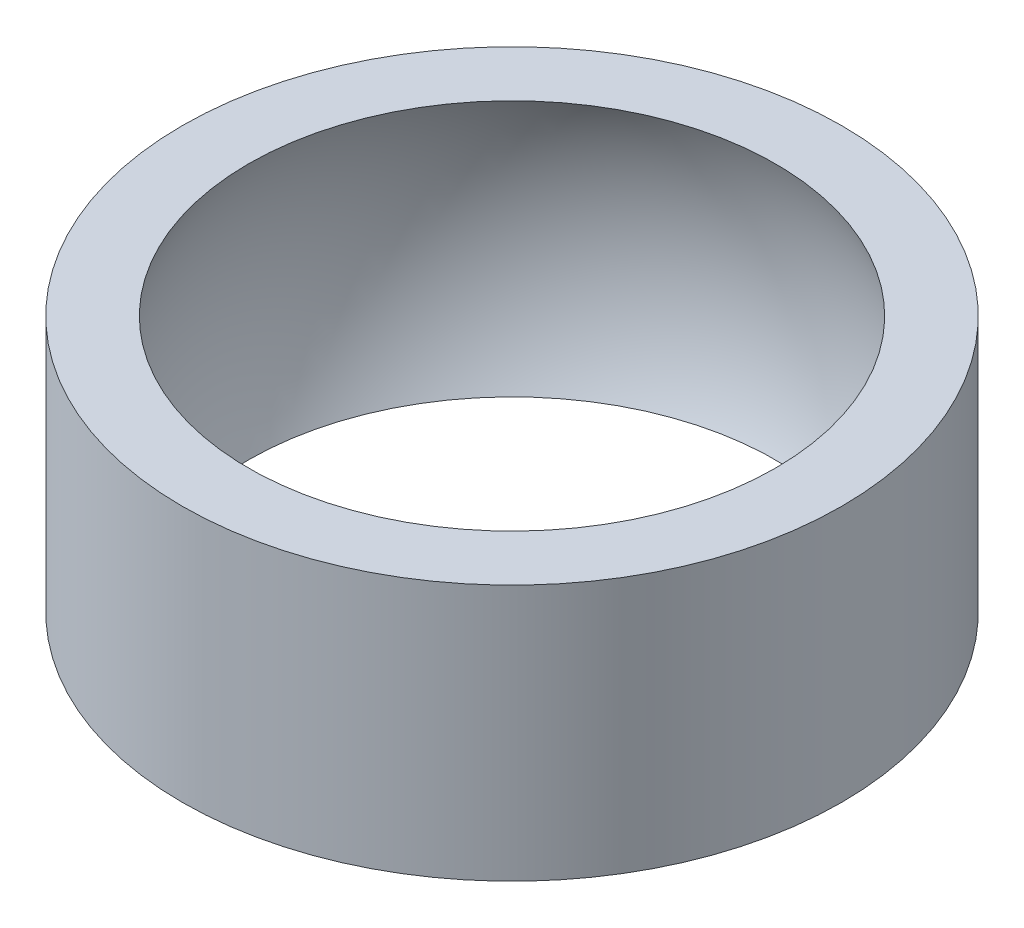
ISO-10303-21;
HEADER;
FILE_DESCRIPTION(('STEP AP214'),'2;1');
FILE_NAME('part.step','',(''),(''),'','','');
FILE_SCHEMA(('AUTOMOTIVE_DESIGN { 1 0 10303 214 1 1 1 1 }'));
ENDSEC;
DATA;
#1=APPLICATION_CONTEXT('core data for automotive mechanical design processes');
#2=APPLICATION_PROTOCOL_DEFINITION('international standard','automotive_design',2000,#1);
#3=PRODUCT_CONTEXT('',#1,'mechanical');
#4=PRODUCT('Part','Part','',(#3));
#5=PRODUCT_RELATED_PRODUCT_CATEGORY('part','',(#4));
#6=PRODUCT_DEFINITION_FORMATION('','',#4);
#7=PRODUCT_DEFINITION_CONTEXT('part definition',#1,'design');
#8=PRODUCT_DEFINITION('design','',#6,#7);
#9=PRODUCT_DEFINITION_SHAPE('','',#8);
#10=(LENGTH_UNIT() NAMED_UNIT(*) SI_UNIT(.MILLI.,.METRE.));
#11=(NAMED_UNIT(*) PLANE_ANGLE_UNIT() SI_UNIT($,.RADIAN.));
#12=(NAMED_UNIT(*) SI_UNIT($,.STERADIAN.) SOLID_ANGLE_UNIT());
#13=UNCERTAINTY_MEASURE_WITH_UNIT(LENGTH_MEASURE(1.E-05),#10,'distance_accuracy_value','');
#14=(GEOMETRIC_REPRESENTATION_CONTEXT(3) GLOBAL_UNCERTAINTY_ASSIGNED_CONTEXT((#13)) GLOBAL_UNIT_ASSIGNED_CONTEXT((#10,
#11,#12)) REPRESENTATION_CONTEXT('',''));
#15=CARTESIAN_POINT('',(0.,0.,0.));
#16=DIRECTION('',(0.,0.,1.));
#17=DIRECTION('',(1.,0.,0.));
#18=AXIS2_PLACEMENT_3D('',#15,#16,#17);
#19=CARTESIAN_POINT('',(0.,0.,0.));
#20=DIRECTION('',(0.,1.,0.));
#21=DIRECTION('',(-1.,0.,0.));
#22=AXIS2_PLACEMENT_3D('',#19,#20,#21);
#23=SPHERICAL_SURFACE('',#22,4.);
#24=CARTESIAN_POINT('',(0.,1.75,0.));
#25=DIRECTION('',(0.,1.,0.));
#26=DIRECTION('',(0.,0.,1.));
#27=AXIS2_PLACEMENT_3D('',#24,#25,#26);
#28=CIRCLE('',#27,3.59687364248454);
#29=CARTESIAN_POINT('',(-3.59687364248454,1.75,0.));
#30=VERTEX_POINT('',#29);
#31=EDGE_CURVE('E10',#30,#30,#28,.T.);
#32=CARTESIAN_POINT('',(0.,-1.75,0.));
#33=DIRECTION('',(0.,1.,0.));
#34=DIRECTION('',(0.,0.,1.));
#35=AXIS2_PLACEMENT_3D('',#32,#33,#34);
#36=CIRCLE('',#35,3.59687364248454);
#37=CARTESIAN_POINT('',(-3.59687364248454,-1.75,0.));
#38=VERTEX_POINT('',#37);
#39=EDGE_CURVE('E46',#38,#38,#36,.T.);
#40=CARTESIAN_POINT('',(-3.59687364248454,1.75,0.));
#41=CARTESIAN_POINT('',(-3.61338272072993,1.71606831182772,0.));
#42=CARTESIAN_POINT('',(-3.62941137263768,1.6819028884554,0.));
#43=CARTESIAN_POINT('',(-3.66049560114603,1.61313221205259,0.));
#44=CARTESIAN_POINT('',(-3.67555117774664,1.57852695902209,0.));
#45=CARTESIAN_POINT('',(-3.70467703300888,1.50890426404481,0.));
#46=CARTESIAN_POINT('',(-3.71874731167052,1.47388682209803,0.));
#47=CARTESIAN_POINT('',(-3.74589134636465,1.40346781453731,0.));
#48=CARTESIAN_POINT('',(-3.75896510239714,1.36806624892338,0.));
#49=CARTESIAN_POINT('',(-3.78410560929955,1.29690734162938,0.));
#50=CARTESIAN_POINT('',(-3.79617236016946,1.26114999994931,0.));
#51=CARTESIAN_POINT('',(-3.81928919571164,1.18930817984011,0.));
#52=CARTESIAN_POINT('',(-3.8303392803839,1.15322370141097,0.));
#53=CARTESIAN_POINT('',(-3.85141393272153,1.08075650730715,0.));
#54=CARTESIAN_POINT('',(-3.8614385003869,1.04437379163247,0.));
#55=CARTESIAN_POINT('',(-3.88045409030962,0.971339261884403,0.));
#56=CARTESIAN_POINT('',(-3.88944511256698,0.934687447811025,0.));
#57=CARTESIAN_POINT('',(-3.90638641074574,0.861144075501694,0.));
#58=CARTESIAN_POINT('',(-3.91433668666715,0.824252517265742,0.));
#59=CARTESIAN_POINT('',(-3.92919012485215,0.750259202912272,0.));
#60=CARTESIAN_POINT('',(-3.93609328711574,0.713157446794754,0.));
#61=CARTESIAN_POINT('',(-3.9488469692709,0.638773451296288,0.));
#62=CARTESIAN_POINT('',(-3.95469748916247,0.601491211915339,0.));
#63=CARTESIAN_POINT('',(-3.96534120092117,0.52677610905884,0.));
#64=CARTESIAN_POINT('',(-3.97013439278831,0.489343245583289,0.));
#65=CARTESIAN_POINT('',(-3.97865960965325,0.414356874339865,0.));
#66=CARTESIAN_POINT('',(-3.98239163465106,0.376803366571991,0.));
#67=CARTESIAN_POINT('',(-3.98879152881636,0.30160578316982,0.));
#68=CARTESIAN_POINT('',(-3.99145939798385,0.263961707535522,0.));
#69=CARTESIAN_POINT('',(-3.99572884380476,0.188613137361727,0.));
#70=CARTESIAN_POINT('',(-3.99733042045817,0.150908642822231,0.));
#71=CARTESIAN_POINT('',(-3.99946599855579,0.0754694321884892,0.));
#72=CARTESIAN_POINT('',(-4.,0.0377347160942446,0.));
#73=CARTESIAN_POINT('',(-4.,-0.0377347160942446,0.));
#74=CARTESIAN_POINT('',(-3.99946599855579,-0.0754694321884892,0.));
#75=CARTESIAN_POINT('',(-3.99733042045817,-0.150908642822231,0.));
#76=CARTESIAN_POINT('',(-3.99572884380476,-0.188613137361727,0.));
#77=CARTESIAN_POINT('',(-3.99145939798385,-0.263961707535522,0.));
#78=CARTESIAN_POINT('',(-3.98879152881636,-0.30160578316982,0.));
#79=CARTESIAN_POINT('',(-3.98239163465106,-0.376803366571991,0.));
#80=CARTESIAN_POINT('',(-3.97865960965325,-0.414356874339865,0.));
#81=CARTESIAN_POINT('',(-3.97013439278831,-0.489343245583289,0.));
#82=CARTESIAN_POINT('',(-3.96534120092117,-0.52677610905884,0.));
#83=CARTESIAN_POINT('',(-3.95469748916247,-0.601491211915339,0.));
#84=CARTESIAN_POINT('',(-3.9488469692709,-0.638773451296288,0.));
#85=CARTESIAN_POINT('',(-3.93609328711574,-0.713157446794755,0.));
#86=CARTESIAN_POINT('',(-3.92919012485215,-0.750259202912272,0.));
#87=CARTESIAN_POINT('',(-3.91433668666715,-0.824252517265742,0.));
#88=CARTESIAN_POINT('',(-3.90638641074574,-0.861144075501694,0.));
#89=CARTESIAN_POINT('',(-3.88944511256698,-0.934687447811025,0.));
#90=CARTESIAN_POINT('',(-3.88045409030962,-0.971339261884402,0.));
#91=CARTESIAN_POINT('',(-3.8614385003869,-1.04437379163247,0.));
#92=CARTESIAN_POINT('',(-3.85141393272153,-1.08075650730715,0.));
#93=CARTESIAN_POINT('',(-3.83033928038391,-1.15322370141097,0.));
#94=CARTESIAN_POINT('',(-3.81928919571164,-1.18930817984011,0.));
#95=CARTESIAN_POINT('',(-3.79617236016946,-1.26114999994931,0.));
#96=CARTESIAN_POINT('',(-3.78410560929955,-1.29690734162938,0.));
#97=CARTESIAN_POINT('',(-3.75896510239714,-1.36806624892338,0.));
#98=CARTESIAN_POINT('',(-3.74589134636465,-1.40346781453731,0.));
#99=CARTESIAN_POINT('',(-3.71874731167052,-1.47388682209803,0.));
#100=CARTESIAN_POINT('',(-3.70467703300888,-1.50890426404481,0.));
#101=CARTESIAN_POINT('',(-3.67555117774664,-1.57852695902209,0.));
#102=CARTESIAN_POINT('',(-3.66049560114603,-1.61313221205259,0.));
#103=CARTESIAN_POINT('',(-3.62941137263768,-1.6819028884554,0.));
#104=CARTESIAN_POINT('',(-3.61338272072993,-1.71606831182772,0.));
#105=CARTESIAN_POINT('',(-3.59687364248454,-1.75,0.));
#106=B_SPLINE_CURVE_WITH_KNOTS('',3,(#40,#41,#42,#43,#44,#45,#46,#47,#48,#49,#50,#51,#52,#53,
#54,#55,#56,#57,#58,#59,#60,#61,#62,#63,#64,#65,#66,#67,#68,#69,#70,#71,#72,#73,#74,#75,#76,#77,
#78,#79,#80,#81,#82,#83,#84,#85,#86,#87,#88,#89,#90,#91,#92,#93,#94,#95,#96,#97,#98,#99,#100,
#101,#102,#103,#104,#105),.UNSPECIFIED.,.F.,.F.,(4,2,2,2,2,2,2,2,2,2,2,2,2,2,2,2,2,2,2,2,2,2,2,
2,2,2,2,2,2,2,2,2,4),(0.,0.113200370777543,0.226400741555087,0.33960111233263,0.452801483110174,
0.566001853887717,0.67920222466526,0.792402595442804,0.905602966220347,1.01880333699789,
1.13200370777543,1.24520407855298,1.35840444933052,1.47160482010806,1.58480519088561,
1.69800556166315,1.81120593244069,1.92440630321824,2.03760667399578,2.15080704477332,
2.26400741555087,2.37720778632841,2.49040815710596,2.6036085278835,2.71680889866104,
2.83000926943859,2.94320964021613,3.05641001099367,3.16961038177122,3.28281075254876,
3.3960111233263,3.50921149410385,3.62241186488139),.UNSPECIFIED.);
#107=EDGE_CURVE('BSEAM32',#30,#38,#106,.T.);
#108=ORIENTED_EDGE('',*,*,#31,.T.);
#109=ORIENTED_EDGE('',*,*,#39,.F.);
#110=ORIENTED_EDGE('',*,*,#107,.T.);
#111=ORIENTED_EDGE('',*,*,#107,.F.);
#112=EDGE_LOOP('',(#108,#110,#109,#111));
#113=FACE_BOUND('',#112,.T.);
#114=ADVANCED_FACE('F32',(#113),#23,.F.);
#115=CARTESIAN_POINT('',(-3.59687364248454,1.75,0.));
#116=DIRECTION('',(0.,1.,0.));
#117=DIRECTION('',(0.,0.,1.));
#118=AXIS2_PLACEMENT_3D('',#115,#116,#117);
#119=PLANE('',#118);
#120=CARTESIAN_POINT('',(0.,1.75,0.));
#121=DIRECTION('',(0.,1.,0.));
#122=DIRECTION('',(0.,0.,1.));
#123=AXIS2_PLACEMENT_3D('',#120,#121,#122);
#124=CIRCLE('',#123,4.5);
#125=CARTESIAN_POINT('',(0.,1.75,4.5));
#126=VERTEX_POINT('',#125);
#127=EDGE_CURVE('E38',#126,#126,#124,.T.);
#128=ORIENTED_EDGE('',*,*,#127,.T.);
#129=EDGE_LOOP('',(#128));
#130=FACE_BOUND('',#129,.T.);
#131=ORIENTED_EDGE('',*,*,#31,.F.);
#132=EDGE_LOOP('',(#131));
#133=FACE_BOUND('',#132,.T.);
#134=ADVANCED_FACE('F56',(#130,#133),#119,.T.);
#135=CARTESIAN_POINT('',(0.,2.56361652074794,0.));
#136=DIRECTION('',(0.,1.,0.));
#137=DIRECTION('',(0.,0.,1.));
#138=AXIS2_PLACEMENT_3D('',#135,#136,#137);
#139=CYLINDRICAL_SURFACE('',#138,4.5);
#140=CARTESIAN_POINT('',(0.,-1.75,0.));
#141=DIRECTION('',(0.,1.,0.));
#142=DIRECTION('',(0.,0.,1.));
#143=AXIS2_PLACEMENT_3D('',#140,#141,#142);
#144=CIRCLE('',#143,4.5);
#145=CARTESIAN_POINT('',(0.,-1.75,4.5));
#146=VERTEX_POINT('',#145);
#147=EDGE_CURVE('E42',#146,#146,#144,.T.);
#148=ORIENTED_EDGE('',*,*,#147,.T.);
#149=EDGE_LOOP('',(#148));
#150=FACE_BOUND('',#149,.T.);
#151=ORIENTED_EDGE('',*,*,#127,.F.);
#152=EDGE_LOOP('',(#151));
#153=FACE_BOUND('',#152,.T.);
#154=ADVANCED_FACE('F60',(#150,#153),#139,.T.);
#155=CARTESIAN_POINT('',(-3.59687364248454,-1.75,0.));
#156=DIRECTION('',(0.,-1.,0.));
#157=DIRECTION('',(0.,0.,-1.));
#158=AXIS2_PLACEMENT_3D('',#155,#156,#157);
#159=PLANE('',#158);
#160=ORIENTED_EDGE('',*,*,#39,.T.);
#161=EDGE_LOOP('',(#160));
#162=FACE_BOUND('',#161,.T.);
#163=ORIENTED_EDGE('',*,*,#147,.F.);
#164=EDGE_LOOP('',(#163));
#165=FACE_BOUND('',#164,.T.);
#166=ADVANCED_FACE('F52',(#162,#165),#159,.T.);
#167=CLOSED_SHELL('',(#114,#134,#154,#166));
#168=MANIFOLD_SOLID_BREP('B2',#167);
#169=ADVANCED_BREP_SHAPE_REPRESENTATION('',(#18,#168),#14);
#170=SHAPE_DEFINITION_REPRESENTATION(#9,#169);
ENDSEC;
END-ISO-10303-21;
